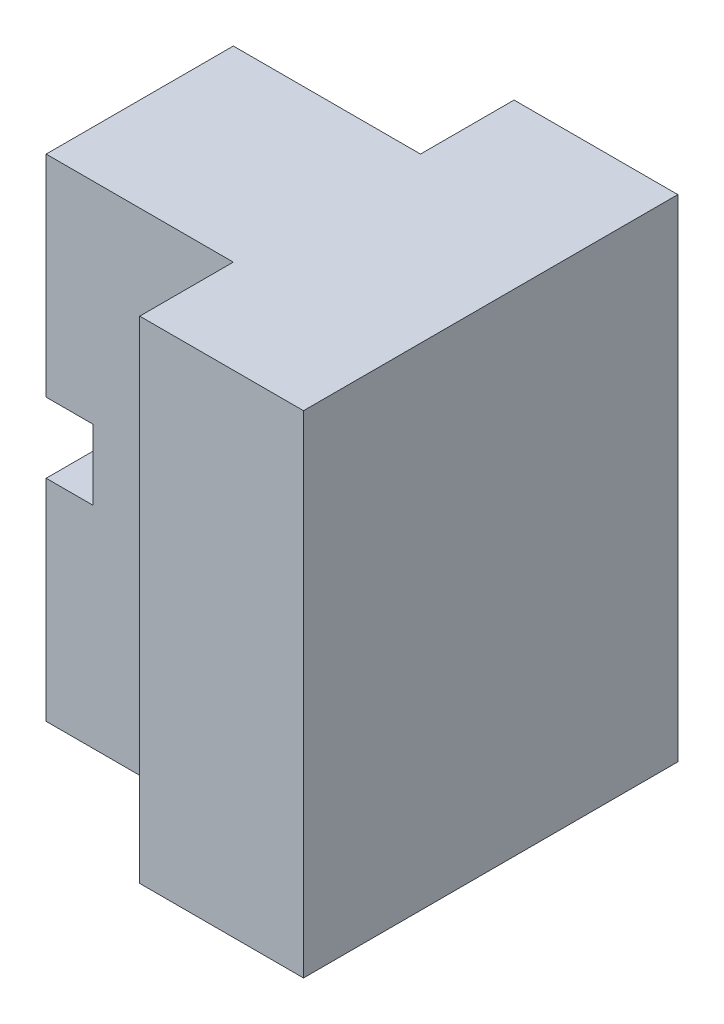
ISO-10303-21;
HEADER;
FILE_DESCRIPTION(('STEP AP214'),'2;1');
FILE_NAME('part.step','',(''),(''),'','','');
FILE_SCHEMA(('AUTOMOTIVE_DESIGN { 1 0 10303 214 1 1 1 1 }'));
ENDSEC;
DATA;
#1=APPLICATION_CONTEXT('core data for automotive mechanical design processes');
#2=APPLICATION_PROTOCOL_DEFINITION('international standard','automotive_design',2000,#1);
#3=PRODUCT_CONTEXT('',#1,'mechanical');
#4=PRODUCT('Part','Part','',(#3));
#5=PRODUCT_RELATED_PRODUCT_CATEGORY('part','',(#4));
#6=PRODUCT_DEFINITION_FORMATION('','',#4);
#7=PRODUCT_DEFINITION_CONTEXT('part definition',#1,'design');
#8=PRODUCT_DEFINITION('design','',#6,#7);
#9=PRODUCT_DEFINITION_SHAPE('','',#8);
#10=(LENGTH_UNIT() NAMED_UNIT(*) SI_UNIT(.MILLI.,.METRE.));
#11=(NAMED_UNIT(*) PLANE_ANGLE_UNIT() SI_UNIT($,.RADIAN.));
#12=(NAMED_UNIT(*) SI_UNIT($,.STERADIAN.) SOLID_ANGLE_UNIT());
#13=UNCERTAINTY_MEASURE_WITH_UNIT(LENGTH_MEASURE(1.E-05),#10,'distance_accuracy_value','');
#14=(GEOMETRIC_REPRESENTATION_CONTEXT(3) GLOBAL_UNCERTAINTY_ASSIGNED_CONTEXT((#13)) GLOBAL_UNIT_ASSIGNED_CONTEXT((#10,
#11,#12)) REPRESENTATION_CONTEXT('',''));
#15=CARTESIAN_POINT('',(0.,0.,0.));
#16=DIRECTION('',(0.,0.,1.));
#17=DIRECTION('',(1.,0.,0.));
#18=AXIS2_PLACEMENT_3D('',#15,#16,#17);
#19=CARTESIAN_POINT('',(-45.,23.,4.));
#20=DIRECTION('',(0.,0.,1.));
#21=DIRECTION('',(1.,0.,0.));
#22=AXIS2_PLACEMENT_3D('',#19,#20,#21);
#23=PLANE('',#22);
#24=DIRECTION('',(1.,0.,0.));
#25=VECTOR('',#24,1.);
#26=CARTESIAN_POINT('',(-32.,14.,4.));
#27=LINE('',#26,#25);
#28=CARTESIAN_POINT('',(-47.,14.,4.));
#29=VERTEX_POINT('',#28);
#30=CARTESIAN_POINT('',(-39.,14.,4.));
#31=VERTEX_POINT('',#30);
#32=EDGE_CURVE('E32',#29,#31,#27,.T.);
#33=ORIENTED_EDGE('',*,*,#32,.T.);
#34=DIRECTION('',(0.,1.,0.));
#35=VECTOR('',#34,1.);
#36=CARTESIAN_POINT('',(-39.,23.,4.));
#37=LINE('',#36,#35);
#38=CARTESIAN_POINT('',(-39.,35.,4.));
#39=VERTEX_POINT('',#38);
#40=EDGE_CURVE('E129',#31,#39,#37,.T.);
#41=ORIENTED_EDGE('',*,*,#40,.T.);
#42=DIRECTION('',(-1.,0.,0.));
#43=VECTOR('',#42,1.);
#44=CARTESIAN_POINT('',(-47.,35.,4.));
#45=LINE('',#44,#43);
#46=CARTESIAN_POINT('',(-47.,35.,4.));
#47=VERTEX_POINT('',#46);
#48=EDGE_CURVE('E145',#39,#47,#45,.T.);
#49=ORIENTED_EDGE('',*,*,#48,.T.);
#50=DIRECTION('',(0.,-1.,0.));
#51=VECTOR('',#50,1.);
#52=CARTESIAN_POINT('',(-47.,26.,4.));
#53=LINE('',#52,#51);
#54=CARTESIAN_POINT('',(-47.,26.,4.));
#55=VERTEX_POINT('',#54);
#56=EDGE_CURVE('E147',#47,#55,#53,.T.);
#57=ORIENTED_EDGE('',*,*,#56,.T.);
#58=DIRECTION('',(1.,0.,0.));
#59=VECTOR('',#58,1.);
#60=CARTESIAN_POINT('',(-45.,26.,4.));
#61=LINE('',#60,#59);
#62=CARTESIAN_POINT('',(-45.,26.,4.));
#63=VERTEX_POINT('',#62);
#64=EDGE_CURVE('E149',#55,#63,#61,.T.);
#65=ORIENTED_EDGE('',*,*,#64,.T.);
#66=DIRECTION('',(0.,-1.,0.));
#67=VECTOR('',#66,1.);
#68=CARTESIAN_POINT('',(-45.,23.,4.));
#69=LINE('',#68,#67);
#70=CARTESIAN_POINT('',(-45.,23.,4.));
#71=VERTEX_POINT('',#70);
#72=EDGE_CURVE('E151',#63,#71,#69,.T.);
#73=ORIENTED_EDGE('',*,*,#72,.T.);
#74=DIRECTION('',(-1.,0.,0.));
#75=VECTOR('',#74,1.);
#76=CARTESIAN_POINT('',(-47.,23.,4.));
#77=LINE('',#76,#75);
#78=CARTESIAN_POINT('',(-47.,23.,4.));
#79=VERTEX_POINT('',#78);
#80=EDGE_CURVE('E138',#71,#79,#77,.T.);
#81=ORIENTED_EDGE('',*,*,#80,.T.);
#82=DIRECTION('',(0.,-1.,0.));
#83=VECTOR('',#82,1.);
#84=CARTESIAN_POINT('',(-47.,14.,4.));
#85=LINE('',#84,#83);
#86=EDGE_CURVE('E141',#79,#29,#85,.T.);
#87=ORIENTED_EDGE('',*,*,#86,.T.);
#88=EDGE_LOOP('',(#33,#41,#49,#57,#65,#73,#81,#87));
#89=FACE_BOUND('',#88,.T.);
#90=ADVANCED_FACE('F17',(#89),#23,.T.);
#91=CARTESIAN_POINT('',(-45.,23.,-4.));
#92=DIRECTION('',(0.,0.,1.));
#93=DIRECTION('',(1.,0.,0.));
#94=AXIS2_PLACEMENT_3D('',#91,#92,#93);
#95=PLANE('',#94);
#96=DIRECTION('',(0.,1.,0.));
#97=VECTOR('',#96,1.);
#98=CARTESIAN_POINT('',(-39.,23.,-4.));
#99=LINE('',#98,#97);
#100=CARTESIAN_POINT('',(-39.,14.,-4.));
#101=VERTEX_POINT('',#100);
#102=CARTESIAN_POINT('',(-39.,35.,-4.));
#103=VERTEX_POINT('',#102);
#104=EDGE_CURVE('E11',#101,#103,#99,.T.);
#105=ORIENTED_EDGE('',*,*,#104,.F.);
#106=DIRECTION('',(1.,0.,0.));
#107=VECTOR('',#106,1.);
#108=CARTESIAN_POINT('',(-32.,14.,-4.));
#109=LINE('',#108,#107);
#110=CARTESIAN_POINT('',(-47.,14.,-4.));
#111=VERTEX_POINT('',#110);
#112=EDGE_CURVE('E158',#111,#101,#109,.T.);
#113=ORIENTED_EDGE('',*,*,#112,.F.);
#114=DIRECTION('',(0.,-1.,0.));
#115=VECTOR('',#114,1.);
#116=CARTESIAN_POINT('',(-47.,14.,-4.));
#117=LINE('',#116,#115);
#118=CARTESIAN_POINT('',(-47.,23.,-4.));
#119=VERTEX_POINT('',#118);
#120=EDGE_CURVE('E156',#119,#111,#117,.T.);
#121=ORIENTED_EDGE('',*,*,#120,.F.);
#122=DIRECTION('',(-1.,0.,0.));
#123=VECTOR('',#122,1.);
#124=CARTESIAN_POINT('',(-47.,23.,-4.));
#125=LINE('',#124,#123);
#126=CARTESIAN_POINT('',(-45.,23.,-4.));
#127=VERTEX_POINT('',#126);
#128=EDGE_CURVE('E132',#127,#119,#125,.T.);
#129=ORIENTED_EDGE('',*,*,#128,.F.);
#130=DIRECTION('',(0.,-1.,0.));
#131=VECTOR('',#130,1.);
#132=CARTESIAN_POINT('',(-45.,23.,-4.));
#133=LINE('',#132,#131);
#134=CARTESIAN_POINT('',(-45.,26.,-4.));
#135=VERTEX_POINT('',#134);
#136=EDGE_CURVE('E142',#135,#127,#133,.T.);
#137=ORIENTED_EDGE('',*,*,#136,.F.);
#138=DIRECTION('',(1.,0.,0.));
#139=VECTOR('',#138,1.);
#140=CARTESIAN_POINT('',(-45.,26.,-4.));
#141=LINE('',#140,#139);
#142=CARTESIAN_POINT('',(-47.,26.,-4.));
#143=VERTEX_POINT('',#142);
#144=EDGE_CURVE('E165',#143,#135,#141,.T.);
#145=ORIENTED_EDGE('',*,*,#144,.F.);
#146=DIRECTION('',(0.,-1.,0.));
#147=VECTOR('',#146,1.);
#148=CARTESIAN_POINT('',(-47.,26.,-4.));
#149=LINE('',#148,#147);
#150=CARTESIAN_POINT('',(-47.,35.,-4.));
#151=VERTEX_POINT('',#150);
#152=EDGE_CURVE('E163',#151,#143,#149,.T.);
#153=ORIENTED_EDGE('',*,*,#152,.F.);
#154=DIRECTION('',(-1.,0.,0.));
#155=VECTOR('',#154,1.);
#156=CARTESIAN_POINT('',(-47.,35.,-4.));
#157=LINE('',#156,#155);
#158=EDGE_CURVE('E161',#103,#151,#157,.T.);
#159=ORIENTED_EDGE('',*,*,#158,.F.);
#160=EDGE_LOOP('',(#105,#113,#121,#129,#137,#145,#153,#159));
#161=FACE_BOUND('',#160,.T.);
#162=ADVANCED_FACE('F196',(#161),#95,.F.);
#163=CARTESIAN_POINT('',(-47.,23.,4.));
#164=DIRECTION('',(0.,-1.,0.));
#165=DIRECTION('',(0.,0.,-1.));
#166=AXIS2_PLACEMENT_3D('',#163,#164,#165);
#167=PLANE('',#166);
#168=ORIENTED_EDGE('',*,*,#128,.T.);
#169=DIRECTION('',(0.,0.,-1.));
#170=VECTOR('',#169,1.);
#171=CARTESIAN_POINT('',(-47.,23.,4.));
#172=LINE('',#171,#170);
#173=EDGE_CURVE('E25',#79,#119,#172,.T.);
#174=ORIENTED_EDGE('',*,*,#173,.F.);
#175=ORIENTED_EDGE('',*,*,#80,.F.);
#176=DIRECTION('',(0.,0.,-1.));
#177=VECTOR('',#176,1.);
#178=CARTESIAN_POINT('',(-45.,23.,4.));
#179=LINE('',#178,#177);
#180=EDGE_CURVE('E153',#71,#127,#179,.T.);
#181=ORIENTED_EDGE('',*,*,#180,.T.);
#182=EDGE_LOOP('',(#168,#174,#175,#181));
#183=FACE_BOUND('',#182,.T.);
#184=ADVANCED_FACE('F19',(#183),#167,.F.);
#185=CARTESIAN_POINT('',(-47.,14.,4.));
#186=DIRECTION('',(1.,0.,0.));
#187=DIRECTION('',(0.,0.,-1.));
#188=AXIS2_PLACEMENT_3D('',#185,#186,#187);
#189=PLANE('',#188);
#190=CARTESIAN_POINT('',(-47.,18.5,0.));
#191=DIRECTION('',(-1.,0.,0.));
#192=DIRECTION('',(0.,0.,1.));
#193=AXIS2_PLACEMENT_3D('',#190,#191,#192);
#194=CIRCLE('',#193,1.65);
#195=CARTESIAN_POINT('',(-47.,18.5,1.65));
#196=VERTEX_POINT('',#195);
#197=EDGE_CURVE('E229',#196,#196,#194,.T.);
#198=ORIENTED_EDGE('',*,*,#197,.F.);
#199=EDGE_LOOP('',(#198));
#200=FACE_BOUND('',#199,.T.);
#201=ORIENTED_EDGE('',*,*,#120,.T.);
#202=DIRECTION('',(0.,0.,-1.));
#203=VECTOR('',#202,1.);
#204=CARTESIAN_POINT('',(-47.,14.,4.));
#205=LINE('',#204,#203);
#206=EDGE_CURVE('E182',#29,#111,#205,.T.);
#207=ORIENTED_EDGE('',*,*,#206,.F.);
#208=ORIENTED_EDGE('',*,*,#86,.F.);
#209=ORIENTED_EDGE('',*,*,#173,.T.);
#210=EDGE_LOOP('',(#201,#207,#208,#209));
#211=FACE_BOUND('',#210,.T.);
#212=ADVANCED_FACE('F187',(#200,#211),#189,.F.);
#213=CARTESIAN_POINT('',(-32.,14.,4.));
#214=DIRECTION('',(0.,1.,0.));
#215=DIRECTION('',(0.,0.,1.));
#216=AXIS2_PLACEMENT_3D('',#213,#214,#215);
#217=PLANE('',#216);
#218=DIRECTION('',(0.,0.,-1.));
#219=VECTOR('',#218,1.);
#220=CARTESIAN_POINT('',(-32.,14.,4.));
#221=LINE('',#220,#219);
#222=CARTESIAN_POINT('',(-32.,14.,8.));
#223=VERTEX_POINT('',#222);
#224=CARTESIAN_POINT('',(-32.,14.,-8.));
#225=VERTEX_POINT('',#224);
#226=EDGE_CURVE('E112',#223,#225,#221,.T.);
#227=ORIENTED_EDGE('',*,*,#226,.F.);
#228=DIRECTION('',(1.,0.,0.));
#229=VECTOR('',#228,1.);
#230=CARTESIAN_POINT('',(-39.,14.,8.));
#231=LINE('',#230,#229);
#232=CARTESIAN_POINT('',(-39.,14.,8.));
#233=VERTEX_POINT('',#232);
#234=EDGE_CURVE('E106',#233,#223,#231,.T.);
#235=ORIENTED_EDGE('',*,*,#234,.F.);
#236=DIRECTION('',(0.,0.,-1.));
#237=VECTOR('',#236,1.);
#238=CARTESIAN_POINT('',(-39.,14.,8.));
#239=LINE('',#238,#237);
#240=EDGE_CURVE('E110',#233,#31,#239,.T.);
#241=ORIENTED_EDGE('',*,*,#240,.T.);
#242=ORIENTED_EDGE('',*,*,#32,.F.);
#243=ORIENTED_EDGE('',*,*,#206,.T.);
#244=ORIENTED_EDGE('',*,*,#112,.T.);
#245=CARTESIAN_POINT('',(-39.,14.,-8.));
#246=VERTEX_POINT('',#245);
#247=EDGE_CURVE('E130',#101,#246,#239,.T.);
#248=ORIENTED_EDGE('',*,*,#247,.T.);
#249=DIRECTION('',(1.,0.,0.));
#250=VECTOR('',#249,1.);
#251=CARTESIAN_POINT('',(-39.,14.,-8.));
#252=LINE('',#251,#250);
#253=EDGE_CURVE('E201',#246,#225,#252,.T.);
#254=ORIENTED_EDGE('',*,*,#253,.T.);
#255=EDGE_LOOP('',(#227,#235,#241,#242,#243,#244,#248,#254));
#256=FACE_BOUND('',#255,.T.);
#257=ADVANCED_FACE('F108',(#256),#217,.F.);
#258=CARTESIAN_POINT('',(-32.,35.,4.));
#259=DIRECTION('',(-1.,0.,0.));
#260=DIRECTION('',(0.,0.,1.));
#261=AXIS2_PLACEMENT_3D('',#258,#259,#260);
#262=PLANE('',#261);
#263=ORIENTED_EDGE('',*,*,#226,.T.);
#264=DIRECTION('',(0.,1.,0.));
#265=VECTOR('',#264,1.);
#266=CARTESIAN_POINT('',(-32.,14.,-8.));
#267=LINE('',#266,#265);
#268=CARTESIAN_POINT('',(-32.,35.,-8.));
#269=VERTEX_POINT('',#268);
#270=EDGE_CURVE('E211',#225,#269,#267,.T.);
#271=ORIENTED_EDGE('',*,*,#270,.T.);
#272=DIRECTION('',(0.,0.,-1.));
#273=VECTOR('',#272,1.);
#274=CARTESIAN_POINT('',(-32.,35.,4.));
#275=LINE('',#274,#273);
#276=CARTESIAN_POINT('',(-32.,35.,8.));
#277=VERTEX_POINT('',#276);
#278=EDGE_CURVE('E179',#277,#269,#275,.T.);
#279=ORIENTED_EDGE('',*,*,#278,.F.);
#280=DIRECTION('',(0.,1.,0.));
#281=VECTOR('',#280,1.);
#282=CARTESIAN_POINT('',(-32.,14.,8.));
#283=LINE('',#282,#281);
#284=EDGE_CURVE('E116',#223,#277,#283,.T.);
#285=ORIENTED_EDGE('',*,*,#284,.F.);
#286=EDGE_LOOP('',(#263,#271,#279,#285));
#287=FACE_BOUND('',#286,.T.);
#288=ADVANCED_FACE('F224',(#287),#262,.F.);
#289=CARTESIAN_POINT('',(-47.,35.,4.));
#290=DIRECTION('',(0.,-1.,0.));
#291=DIRECTION('',(0.,0.,-1.));
#292=AXIS2_PLACEMENT_3D('',#289,#290,#291);
#293=PLANE('',#292);
#294=ORIENTED_EDGE('',*,*,#278,.T.);
#295=DIRECTION('',(-1.,0.,0.));
#296=VECTOR('',#295,1.);
#297=CARTESIAN_POINT('',(-32.,35.,-8.));
#298=LINE('',#297,#296);
#299=CARTESIAN_POINT('',(-39.,35.,-8.));
#300=VERTEX_POINT('',#299);
#301=EDGE_CURVE('E126',#269,#300,#298,.T.);
#302=ORIENTED_EDGE('',*,*,#301,.T.);
#303=DIRECTION('',(0.,0.,-1.));
#304=VECTOR('',#303,1.);
#305=CARTESIAN_POINT('',(-39.,35.,8.));
#306=LINE('',#305,#304);
#307=EDGE_CURVE('E40',#103,#300,#306,.T.);
#308=ORIENTED_EDGE('',*,*,#307,.F.);
#309=ORIENTED_EDGE('',*,*,#158,.T.);
#310=DIRECTION('',(0.,0.,-1.));
#311=VECTOR('',#310,1.);
#312=CARTESIAN_POINT('',(-47.,35.,4.));
#313=LINE('',#312,#311);
#314=EDGE_CURVE('E176',#47,#151,#313,.T.);
#315=ORIENTED_EDGE('',*,*,#314,.F.);
#316=ORIENTED_EDGE('',*,*,#48,.F.);
#317=CARTESIAN_POINT('',(-39.,35.,8.));
#318=VERTEX_POINT('',#317);
#319=EDGE_CURVE('E134',#318,#39,#306,.T.);
#320=ORIENTED_EDGE('',*,*,#319,.F.);
#321=DIRECTION('',(-1.,0.,0.));
#322=VECTOR('',#321,1.);
#323=CARTESIAN_POINT('',(-32.,35.,8.));
#324=LINE('',#323,#322);
#325=EDGE_CURVE('E122',#277,#318,#324,.T.);
#326=ORIENTED_EDGE('',*,*,#325,.F.);
#327=EDGE_LOOP('',(#294,#302,#308,#309,#315,#316,#320,#326));
#328=FACE_BOUND('',#327,.T.);
#329=ADVANCED_FACE('F222',(#328),#293,.F.);
#330=CARTESIAN_POINT('',(-47.,26.,4.));
#331=DIRECTION('',(1.,0.,0.));
#332=DIRECTION('',(0.,0.,-1.));
#333=AXIS2_PLACEMENT_3D('',#330,#331,#332);
#334=PLANE('',#333);
#335=CARTESIAN_POINT('',(-47.,30.5,0.));
#336=DIRECTION('',(-1.,0.,0.));
#337=DIRECTION('',(0.,0.,1.));
#338=AXIS2_PLACEMENT_3D('',#335,#336,#337);
#339=CIRCLE('',#338,1.65);
#340=CARTESIAN_POINT('',(-47.,30.5,1.65));
#341=VERTEX_POINT('',#340);
#342=EDGE_CURVE('E217',#341,#341,#339,.T.);
#343=ORIENTED_EDGE('',*,*,#342,.F.);
#344=EDGE_LOOP('',(#343));
#345=FACE_BOUND('',#344,.T.);
#346=ORIENTED_EDGE('',*,*,#152,.T.);
#347=DIRECTION('',(0.,0.,-1.));
#348=VECTOR('',#347,1.);
#349=CARTESIAN_POINT('',(-47.,26.,4.));
#350=LINE('',#349,#348);
#351=EDGE_CURVE('E173',#55,#143,#350,.T.);
#352=ORIENTED_EDGE('',*,*,#351,.F.);
#353=ORIENTED_EDGE('',*,*,#56,.F.);
#354=ORIENTED_EDGE('',*,*,#314,.T.);
#355=EDGE_LOOP('',(#346,#352,#353,#354));
#356=FACE_BOUND('',#355,.T.);
#357=ADVANCED_FACE('F267',(#345,#356),#334,.F.);
#358=CARTESIAN_POINT('',(-45.,26.,4.));
#359=DIRECTION('',(0.,1.,0.));
#360=DIRECTION('',(0.,0.,1.));
#361=AXIS2_PLACEMENT_3D('',#358,#359,#360);
#362=PLANE('',#361);
#363=ORIENTED_EDGE('',*,*,#144,.T.);
#364=DIRECTION('',(0.,0.,-1.));
#365=VECTOR('',#364,1.);
#366=CARTESIAN_POINT('',(-45.,26.,4.));
#367=LINE('',#366,#365);
#368=EDGE_CURVE('E170',#63,#135,#367,.T.);
#369=ORIENTED_EDGE('',*,*,#368,.F.);
#370=ORIENTED_EDGE('',*,*,#64,.F.);
#371=ORIENTED_EDGE('',*,*,#351,.T.);
#372=EDGE_LOOP('',(#363,#369,#370,#371));
#373=FACE_BOUND('',#372,.T.);
#374=ADVANCED_FACE('F263',(#373),#362,.F.);
#375=CARTESIAN_POINT('',(-45.,23.,4.));
#376=DIRECTION('',(1.,0.,0.));
#377=DIRECTION('',(0.,0.,-1.));
#378=AXIS2_PLACEMENT_3D('',#375,#376,#377);
#379=PLANE('',#378);
#380=ORIENTED_EDGE('',*,*,#136,.T.);
#381=ORIENTED_EDGE('',*,*,#180,.F.);
#382=ORIENTED_EDGE('',*,*,#72,.F.);
#383=ORIENTED_EDGE('',*,*,#368,.T.);
#384=EDGE_LOOP('',(#380,#381,#382,#383));
#385=FACE_BOUND('',#384,.T.);
#386=ADVANCED_FACE('F260',(#385),#379,.F.);
#387=CARTESIAN_POINT('',(-39.,14.,-8.));
#388=DIRECTION('',(0.,0.,1.));
#389=DIRECTION('',(1.,0.,0.));
#390=AXIS2_PLACEMENT_3D('',#387,#388,#389);
#391=PLANE('',#390);
#392=DIRECTION('',(0.,-1.,0.));
#393=VECTOR('',#392,1.);
#394=CARTESIAN_POINT('',(-39.,35.,-8.));
#395=LINE('',#394,#393);
#396=EDGE_CURVE('E209',#300,#246,#395,.T.);
#397=ORIENTED_EDGE('',*,*,#396,.F.);
#398=ORIENTED_EDGE('',*,*,#301,.F.);
#399=ORIENTED_EDGE('',*,*,#270,.F.);
#400=ORIENTED_EDGE('',*,*,#253,.F.);
#401=EDGE_LOOP('',(#397,#398,#399,#400));
#402=FACE_BOUND('',#401,.T.);
#403=ADVANCED_FACE('F207',(#402),#391,.F.);
#404=CARTESIAN_POINT('',(-39.,35.,8.));
#405=DIRECTION('',(1.,0.,0.));
#406=DIRECTION('',(0.,0.,-1.));
#407=AXIS2_PLACEMENT_3D('',#404,#405,#406);
#408=PLANE('',#407);
#409=ORIENTED_EDGE('',*,*,#247,.F.);
#410=ORIENTED_EDGE('',*,*,#104,.T.);
#411=ORIENTED_EDGE('',*,*,#307,.T.);
#412=ORIENTED_EDGE('',*,*,#396,.T.);
#413=EDGE_LOOP('',(#409,#410,#411,#412));
#414=FACE_BOUND('',#413,.T.);
#415=ADVANCED_FACE('F213',(#414),#408,.F.);
#416=ORIENTED_EDGE('',*,*,#40,.F.);
#417=ORIENTED_EDGE('',*,*,#240,.F.);
#418=DIRECTION('',(0.,-1.,0.));
#419=VECTOR('',#418,1.);
#420=CARTESIAN_POINT('',(-39.,35.,8.));
#421=LINE('',#420,#419);
#422=EDGE_CURVE('E117',#318,#233,#421,.T.);
#423=ORIENTED_EDGE('',*,*,#422,.F.);
#424=ORIENTED_EDGE('',*,*,#319,.T.);
#425=EDGE_LOOP('',(#416,#417,#423,#424));
#426=FACE_BOUND('',#425,.T.);
#427=ADVANCED_FACE('F128',(#426),#408,.F.);
#428=CARTESIAN_POINT('',(-39.,14.,8.));
#429=DIRECTION('',(0.,0.,1.));
#430=DIRECTION('',(1.,0.,0.));
#431=AXIS2_PLACEMENT_3D('',#428,#429,#430);
#432=PLANE('',#431);
#433=ORIENTED_EDGE('',*,*,#422,.T.);
#434=ORIENTED_EDGE('',*,*,#234,.T.);
#435=ORIENTED_EDGE('',*,*,#284,.T.);
#436=ORIENTED_EDGE('',*,*,#325,.T.);
#437=EDGE_LOOP('',(#433,#434,#435,#436));
#438=FACE_BOUND('',#437,.T.);
#439=ADVANCED_FACE('F120',(#438),#432,.T.);
#440=CARTESIAN_POINT('',(-39.,30.5,0.));
#441=DIRECTION('',(-1.,0.,0.));
#442=DIRECTION('',(0.,0.,1.));
#443=AXIS2_PLACEMENT_3D('',#440,#441,#442);
#444=CYLINDRICAL_SURFACE('',#443,1.65);
#445=CARTESIAN_POINT('',(-39.,30.5,0.));
#446=DIRECTION('',(-1.,0.,0.));
#447=DIRECTION('',(0.,0.,1.));
#448=AXIS2_PLACEMENT_3D('',#445,#446,#447);
#449=CIRCLE('',#448,1.65);
#450=CARTESIAN_POINT('',(-39.,30.5,1.65));
#451=VERTEX_POINT('',#450);
#452=EDGE_CURVE('E214',#451,#451,#449,.T.);
#453=ORIENTED_EDGE('',*,*,#452,.F.);
#454=EDGE_LOOP('',(#453));
#455=FACE_BOUND('',#454,.T.);
#456=ORIENTED_EDGE('',*,*,#342,.T.);
#457=EDGE_LOOP('',(#456));
#458=FACE_BOUND('',#457,.T.);
#459=ADVANCED_FACE('F326',(#455,#458),#444,.F.);
#460=CARTESIAN_POINT('',(-39.,30.5,0.));
#461=DIRECTION('',(-1.,0.,0.));
#462=DIRECTION('',(0.,0.,1.));
#463=AXIS2_PLACEMENT_3D('',#460,#461,#462);
#464=PLANE('',#463);
#465=ORIENTED_EDGE('',*,*,#452,.T.);
#466=EDGE_LOOP('',(#465));
#467=FACE_BOUND('',#466,.T.);
#468=ADVANCED_FACE('F240',(#467),#464,.T.);
#469=CARTESIAN_POINT('',(-39.,18.5,0.));
#470=DIRECTION('',(-1.,0.,0.));
#471=DIRECTION('',(0.,0.,1.));
#472=AXIS2_PLACEMENT_3D('',#469,#470,#471);
#473=CYLINDRICAL_SURFACE('',#472,1.65);
#474=CARTESIAN_POINT('',(-39.,18.5,0.));
#475=DIRECTION('',(-1.,0.,0.));
#476=DIRECTION('',(0.,0.,1.));
#477=AXIS2_PLACEMENT_3D('',#474,#475,#476);
#478=CIRCLE('',#477,1.65);
#479=CARTESIAN_POINT('',(-39.,18.5,1.65));
#480=VERTEX_POINT('',#479);
#481=EDGE_CURVE('E227',#480,#480,#478,.T.);
#482=ORIENTED_EDGE('',*,*,#481,.F.);
#483=EDGE_LOOP('',(#482));
#484=FACE_BOUND('',#483,.T.);
#485=ORIENTED_EDGE('',*,*,#197,.T.);
#486=EDGE_LOOP('',(#485));
#487=FACE_BOUND('',#486,.T.);
#488=ADVANCED_FACE('F237',(#484,#487),#473,.F.);
#489=CARTESIAN_POINT('',(-39.,18.5,0.));
#490=DIRECTION('',(-1.,0.,0.));
#491=DIRECTION('',(0.,0.,1.));
#492=AXIS2_PLACEMENT_3D('',#489,#490,#491);
#493=PLANE('',#492);
#494=ORIENTED_EDGE('',*,*,#481,.T.);
#495=EDGE_LOOP('',(#494));
#496=FACE_BOUND('',#495,.T.);
#497=ADVANCED_FACE('F235',(#496),#493,.T.);
#498=CLOSED_SHELL('',(#90,#162,#184,#212,#257,#288,#329,#357,#374,#386,#403,#415,#427,#439,#459,
#468,#488,#497));
#499=MANIFOLD_SOLID_BREP('B1',#498);
#500=ADVANCED_BREP_SHAPE_REPRESENTATION('',(#18,#499),#14);
#501=SHAPE_DEFINITION_REPRESENTATION(#9,#500);
ENDSEC;
END-ISO-10303-21;
